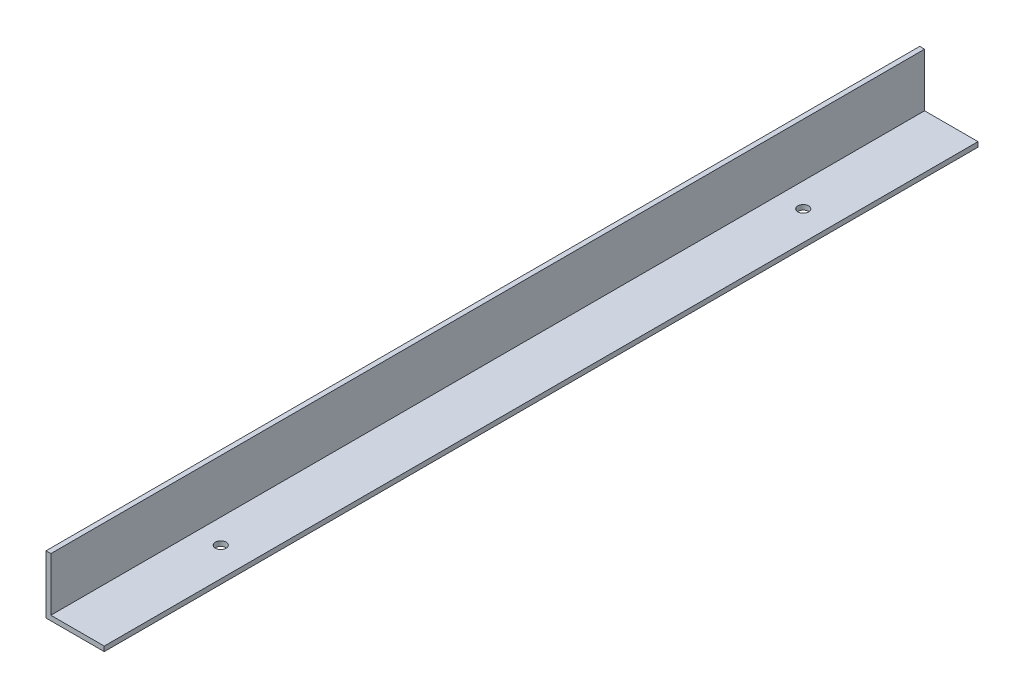
ISO-10303-21;
HEADER;
FILE_DESCRIPTION(('STEP AP214'),'2;1');
FILE_NAME('part.step','',(''),(''),'','','');
FILE_SCHEMA(('AUTOMOTIVE_DESIGN { 1 0 10303 214 1 1 1 1 }'));
ENDSEC;
DATA;
#1=APPLICATION_CONTEXT('core data for automotive mechanical design processes');
#2=APPLICATION_PROTOCOL_DEFINITION('international standard','automotive_design',2000,#1);
#3=PRODUCT_CONTEXT('',#1,'mechanical');
#4=PRODUCT('Part','Part','',(#3));
#5=PRODUCT_RELATED_PRODUCT_CATEGORY('part','',(#4));
#6=PRODUCT_DEFINITION_FORMATION('','',#4);
#7=PRODUCT_DEFINITION_CONTEXT('part definition',#1,'design');
#8=PRODUCT_DEFINITION('design','',#6,#7);
#9=PRODUCT_DEFINITION_SHAPE('','',#8);
#10=(LENGTH_UNIT() NAMED_UNIT(*) SI_UNIT(.MILLI.,.METRE.));
#11=(NAMED_UNIT(*) PLANE_ANGLE_UNIT() SI_UNIT($,.RADIAN.));
#12=(NAMED_UNIT(*) SI_UNIT($,.STERADIAN.) SOLID_ANGLE_UNIT());
#13=UNCERTAINTY_MEASURE_WITH_UNIT(LENGTH_MEASURE(1.E-05),#10,'distance_accuracy_value','');
#14=(GEOMETRIC_REPRESENTATION_CONTEXT(3) GLOBAL_UNCERTAINTY_ASSIGNED_CONTEXT((#13)) GLOBAL_UNIT_ASSIGNED_CONTEXT((#10,
#11,#12)) REPRESENTATION_CONTEXT('',''));
#15=CARTESIAN_POINT('',(0.,0.,0.));
#16=DIRECTION('',(0.,0.,1.));
#17=DIRECTION('',(1.,0.,0.));
#18=AXIS2_PLACEMENT_3D('',#15,#16,#17);
#19=CARTESIAN_POINT('',(0.,120.,1800.));
#20=DIRECTION('',(1.,0.,0.));
#21=DIRECTION('',(0.,1.,0.));
#22=AXIS2_PLACEMENT_3D('',#19,#20,#21);
#23=PLANE('',#22);
#24=DIRECTION('',(0.,-1.,0.));
#25=VECTOR('',#24,1.);
#26=CARTESIAN_POINT('',(0.,120.,0.));
#27=LINE('',#26,#25);
#28=CARTESIAN_POINT('',(0.,120.,0.));
#29=VERTEX_POINT('',#28);
#30=CARTESIAN_POINT('',(0.,0.,0.));
#31=VERTEX_POINT('',#30);
#32=EDGE_CURVE('E120',#29,#31,#27,.T.);
#33=ORIENTED_EDGE('',*,*,#32,.T.);
#34=DIRECTION('',(0.,0.,-1.));
#35=VECTOR('',#34,1.);
#36=CARTESIAN_POINT('',(0.,0.,1800.));
#37=LINE('',#36,#35);
#38=CARTESIAN_POINT('',(0.,0.,1800.));
#39=VERTEX_POINT('',#38);
#40=EDGE_CURVE('E11',#39,#31,#37,.T.);
#41=ORIENTED_EDGE('',*,*,#40,.F.);
#42=DIRECTION('',(0.,-1.,0.));
#43=VECTOR('',#42,1.);
#44=CARTESIAN_POINT('',(0.,120.,1800.));
#45=LINE('',#44,#43);
#46=CARTESIAN_POINT('',(0.,120.,1800.));
#47=VERTEX_POINT('',#46);
#48=EDGE_CURVE('E131',#47,#39,#45,.T.);
#49=ORIENTED_EDGE('',*,*,#48,.F.);
#50=DIRECTION('',(0.,0.,-1.));
#51=VECTOR('',#50,1.);
#52=CARTESIAN_POINT('',(0.,120.,1800.));
#53=LINE('',#52,#51);
#54=EDGE_CURVE('E116',#47,#29,#53,.T.);
#55=ORIENTED_EDGE('',*,*,#54,.T.);
#56=EDGE_LOOP('',(#33,#41,#49,#55));
#57=FACE_BOUND('',#56,.T.);
#58=ADVANCED_FACE('F34',(#57),#23,.F.);
#59=CARTESIAN_POINT('',(0.,0.,1800.));
#60=DIRECTION('',(0.,1.,0.));
#61=DIRECTION('',(0.,0.,1.));
#62=AXIS2_PLACEMENT_3D('',#59,#60,#61);
#63=PLANE('',#62);
#64=CARTESIAN_POINT('',(60.0000000000001,0.,300.));
#65=DIRECTION('',(0.,-1.,0.));
#66=DIRECTION('',(0.,0.,-1.));
#67=AXIS2_PLACEMENT_3D('',#64,#65,#66);
#68=CIRCLE('',#67,11.);
#69=CARTESIAN_POINT('',(60.0000000000001,0.,289.));
#70=VERTEX_POINT('',#69);
#71=EDGE_CURVE('E145',#70,#70,#68,.T.);
#72=ORIENTED_EDGE('',*,*,#71,.F.);
#73=EDGE_LOOP('',(#72));
#74=FACE_BOUND('',#73,.T.);
#75=CARTESIAN_POINT('',(60.,0.,1500.));
#76=DIRECTION('',(0.,-1.,0.));
#77=DIRECTION('',(0.,0.,-1.));
#78=AXIS2_PLACEMENT_3D('',#75,#76,#77);
#79=CIRCLE('',#78,11.);
#80=CARTESIAN_POINT('',(60.,0.,1489.));
#81=VERTEX_POINT('',#80);
#82=EDGE_CURVE('E137',#81,#81,#79,.T.);
#83=ORIENTED_EDGE('',*,*,#82,.F.);
#84=EDGE_LOOP('',(#83));
#85=FACE_BOUND('',#84,.T.);
#86=DIRECTION('',(1.,0.,0.));
#87=VECTOR('',#86,1.);
#88=CARTESIAN_POINT('',(0.,0.,0.));
#89=LINE('',#88,#87);
#90=CARTESIAN_POINT('',(120.,0.,0.));
#91=VERTEX_POINT('',#90);
#92=EDGE_CURVE('E123',#31,#91,#89,.T.);
#93=ORIENTED_EDGE('',*,*,#92,.T.);
#94=DIRECTION('',(0.,0.,-1.));
#95=VECTOR('',#94,1.);
#96=CARTESIAN_POINT('',(120.,0.,1800.));
#97=LINE('',#96,#95);
#98=CARTESIAN_POINT('',(120.,0.,1800.));
#99=VERTEX_POINT('',#98);
#100=EDGE_CURVE('E43',#99,#91,#97,.T.);
#101=ORIENTED_EDGE('',*,*,#100,.F.);
#102=DIRECTION('',(1.,0.,0.));
#103=VECTOR('',#102,1.);
#104=CARTESIAN_POINT('',(0.,0.,1800.));
#105=LINE('',#104,#103);
#106=EDGE_CURVE('E89',#39,#99,#105,.T.);
#107=ORIENTED_EDGE('',*,*,#106,.F.);
#108=ORIENTED_EDGE('',*,*,#40,.T.);
#109=EDGE_LOOP('',(#93,#101,#107,#108));
#110=FACE_BOUND('',#109,.T.);
#111=ADVANCED_FACE('F151',(#74,#85,#110),#63,.F.);
#112=CARTESIAN_POINT('',(120.,0.,1800.));
#113=DIRECTION('',(-1.,0.,0.));
#114=DIRECTION('',(0.,0.,1.));
#115=AXIS2_PLACEMENT_3D('',#112,#113,#114);
#116=PLANE('',#115);
#117=DIRECTION('',(0.,1.,0.));
#118=VECTOR('',#117,1.);
#119=CARTESIAN_POINT('',(120.,0.,0.));
#120=LINE('',#119,#118);
#121=CARTESIAN_POINT('',(120.,10.,0.));
#122=VERTEX_POINT('',#121);
#123=EDGE_CURVE('E126',#91,#122,#120,.T.);
#124=ORIENTED_EDGE('',*,*,#123,.T.);
#125=DIRECTION('',(0.,0.,-1.));
#126=VECTOR('',#125,1.);
#127=CARTESIAN_POINT('',(120.,10.,1800.));
#128=LINE('',#127,#126);
#129=CARTESIAN_POINT('',(120.,10.,1800.));
#130=VERTEX_POINT('',#129);
#131=EDGE_CURVE('E111',#130,#122,#128,.T.);
#132=ORIENTED_EDGE('',*,*,#131,.F.);
#133=DIRECTION('',(0.,1.,0.));
#134=VECTOR('',#133,1.);
#135=CARTESIAN_POINT('',(120.,0.,1800.));
#136=LINE('',#135,#134);
#137=EDGE_CURVE('E102',#99,#130,#136,.T.);
#138=ORIENTED_EDGE('',*,*,#137,.F.);
#139=ORIENTED_EDGE('',*,*,#100,.T.);
#140=EDGE_LOOP('',(#124,#132,#138,#139));
#141=FACE_BOUND('',#140,.T.);
#142=ADVANCED_FACE('F154',(#141),#116,.F.);
#143=CARTESIAN_POINT('',(120.,10.,1800.));
#144=DIRECTION('',(0.,-1.,0.));
#145=DIRECTION('',(1.,0.,0.));
#146=AXIS2_PLACEMENT_3D('',#143,#144,#145);
#147=PLANE('',#146);
#148=CARTESIAN_POINT('',(60.0000000000001,9.99999999999999,300.));
#149=DIRECTION('',(0.,-1.,0.));
#150=DIRECTION('',(1.,0.,0.));
#151=AXIS2_PLACEMENT_3D('',#148,#149,#150);
#152=CIRCLE('',#151,11.);
#153=CARTESIAN_POINT('',(71.0000000000001,9.99999999999999,300.));
#154=VERTEX_POINT('',#153);
#155=EDGE_CURVE('E37',#154,#154,#152,.T.);
#156=ORIENTED_EDGE('',*,*,#155,.T.);
#157=EDGE_LOOP('',(#156));
#158=FACE_BOUND('',#157,.T.);
#159=CARTESIAN_POINT('',(60.,9.99999999999999,1500.));
#160=DIRECTION('',(0.,-1.,0.));
#161=DIRECTION('',(1.,0.,0.));
#162=AXIS2_PLACEMENT_3D('',#159,#160,#161);
#163=CIRCLE('',#162,11.);
#164=CARTESIAN_POINT('',(71.,9.99999999999999,1500.));
#165=VERTEX_POINT('',#164);
#166=EDGE_CURVE('E124',#165,#165,#163,.T.);
#167=ORIENTED_EDGE('',*,*,#166,.T.);
#168=EDGE_LOOP('',(#167));
#169=FACE_BOUND('',#168,.T.);
#170=DIRECTION('',(-1.,0.,0.));
#171=VECTOR('',#170,1.);
#172=CARTESIAN_POINT('',(120.,10.,0.));
#173=LINE('',#172,#171);
#174=CARTESIAN_POINT('',(10.,9.99999999999999,0.));
#175=VERTEX_POINT('',#174);
#176=EDGE_CURVE('E110',#122,#175,#173,.T.);
#177=ORIENTED_EDGE('',*,*,#176,.T.);
#178=DIRECTION('',(0.,0.,-1.));
#179=VECTOR('',#178,1.);
#180=CARTESIAN_POINT('',(10.,9.99999999999999,1800.));
#181=LINE('',#180,#179);
#182=CARTESIAN_POINT('',(10.,9.99999999999999,1800.));
#183=VERTEX_POINT('',#182);
#184=EDGE_CURVE('E107',#183,#175,#181,.T.);
#185=ORIENTED_EDGE('',*,*,#184,.F.);
#186=DIRECTION('',(-1.,0.,0.));
#187=VECTOR('',#186,1.);
#188=CARTESIAN_POINT('',(120.,10.,1800.));
#189=LINE('',#188,#187);
#190=EDGE_CURVE('E96',#130,#183,#189,.T.);
#191=ORIENTED_EDGE('',*,*,#190,.F.);
#192=ORIENTED_EDGE('',*,*,#131,.T.);
#193=EDGE_LOOP('',(#177,#185,#191,#192));
#194=FACE_BOUND('',#193,.T.);
#195=ADVANCED_FACE('F108',(#158,#169,#194),#147,.F.);
#196=CARTESIAN_POINT('',(10.,9.99999999999999,1800.));
#197=DIRECTION('',(-1.,0.,0.));
#198=DIRECTION('',(0.,-1.,0.));
#199=AXIS2_PLACEMENT_3D('',#196,#197,#198);
#200=PLANE('',#199);
#201=DIRECTION('',(0.,1.,0.));
#202=VECTOR('',#201,1.);
#203=CARTESIAN_POINT('',(10.,9.99999999999999,0.));
#204=LINE('',#203,#202);
#205=CARTESIAN_POINT('',(9.99999999999999,120.,0.));
#206=VERTEX_POINT('',#205);
#207=EDGE_CURVE('E75',#175,#206,#204,.T.);
#208=ORIENTED_EDGE('',*,*,#207,.T.);
#209=DIRECTION('',(0.,0.,-1.));
#210=VECTOR('',#209,1.);
#211=CARTESIAN_POINT('',(9.99999999999999,120.,1800.));
#212=LINE('',#211,#210);
#213=CARTESIAN_POINT('',(9.99999999999999,120.,1800.));
#214=VERTEX_POINT('',#213);
#215=EDGE_CURVE('E112',#214,#206,#212,.T.);
#216=ORIENTED_EDGE('',*,*,#215,.F.);
#217=DIRECTION('',(0.,1.,0.));
#218=VECTOR('',#217,1.);
#219=CARTESIAN_POINT('',(10.,9.99999999999999,1800.));
#220=LINE('',#219,#218);
#221=EDGE_CURVE('E100',#183,#214,#220,.T.);
#222=ORIENTED_EDGE('',*,*,#221,.F.);
#223=ORIENTED_EDGE('',*,*,#184,.T.);
#224=EDGE_LOOP('',(#208,#216,#222,#223));
#225=FACE_BOUND('',#224,.T.);
#226=ADVANCED_FACE('F114',(#225),#200,.F.);
#227=CARTESIAN_POINT('',(9.99999999999999,120.,1800.));
#228=DIRECTION('',(0.,-1.,0.));
#229=DIRECTION('',(0.,0.,-1.));
#230=AXIS2_PLACEMENT_3D('',#227,#228,#229);
#231=PLANE('',#230);
#232=DIRECTION('',(-1.,0.,0.));
#233=VECTOR('',#232,1.);
#234=CARTESIAN_POINT('',(9.99999999999999,120.,0.));
#235=LINE('',#234,#233);
#236=EDGE_CURVE('E81',#206,#29,#235,.T.);
#237=ORIENTED_EDGE('',*,*,#236,.T.);
#238=ORIENTED_EDGE('',*,*,#54,.F.);
#239=DIRECTION('',(-1.,0.,0.));
#240=VECTOR('',#239,1.);
#241=CARTESIAN_POINT('',(9.99999999999999,120.,1800.));
#242=LINE('',#241,#240);
#243=EDGE_CURVE('E52',#214,#47,#242,.T.);
#244=ORIENTED_EDGE('',*,*,#243,.F.);
#245=ORIENTED_EDGE('',*,*,#215,.T.);
#246=EDGE_LOOP('',(#237,#238,#244,#245));
#247=FACE_BOUND('',#246,.T.);
#248=ADVANCED_FACE('F159',(#247),#231,.F.);
#249=CARTESIAN_POINT('',(0.,0.,1800.));
#250=DIRECTION('',(0.,0.,1.));
#251=DIRECTION('',(1.,0.,0.));
#252=AXIS2_PLACEMENT_3D('',#249,#250,#251);
#253=PLANE('',#252);
#254=ORIENTED_EDGE('',*,*,#48,.T.);
#255=ORIENTED_EDGE('',*,*,#106,.T.);
#256=ORIENTED_EDGE('',*,*,#137,.T.);
#257=ORIENTED_EDGE('',*,*,#190,.T.);
#258=ORIENTED_EDGE('',*,*,#221,.T.);
#259=ORIENTED_EDGE('',*,*,#243,.T.);
#260=EDGE_LOOP('',(#254,#255,#256,#257,#258,#259));
#261=FACE_BOUND('',#260,.T.);
#262=ADVANCED_FACE('F98',(#261),#253,.T.);
#263=CARTESIAN_POINT('',(0.,0.,0.));
#264=DIRECTION('',(0.,0.,1.));
#265=DIRECTION('',(1.,0.,0.));
#266=AXIS2_PLACEMENT_3D('',#263,#264,#265);
#267=PLANE('',#266);
#268=ORIENTED_EDGE('',*,*,#32,.F.);
#269=ORIENTED_EDGE('',*,*,#236,.F.);
#270=ORIENTED_EDGE('',*,*,#207,.F.);
#271=ORIENTED_EDGE('',*,*,#176,.F.);
#272=ORIENTED_EDGE('',*,*,#123,.F.);
#273=ORIENTED_EDGE('',*,*,#92,.F.);
#274=EDGE_LOOP('',(#268,#269,#270,#271,#272,#273));
#275=FACE_BOUND('',#274,.T.);
#276=ADVANCED_FACE('F157',(#275),#267,.F.);
#277=CARTESIAN_POINT('',(60.,120.,1500.));
#278=DIRECTION('',(0.,-1.,0.));
#279=DIRECTION('',(0.,0.,-1.));
#280=AXIS2_PLACEMENT_3D('',#277,#278,#279);
#281=CYLINDRICAL_SURFACE('',#280,11.);
#282=ORIENTED_EDGE('',*,*,#82,.T.);
#283=EDGE_LOOP('',(#282));
#284=FACE_BOUND('',#283,.T.);
#285=ORIENTED_EDGE('',*,*,#166,.F.);
#286=EDGE_LOOP('',(#285));
#287=FACE_BOUND('',#286,.T.);
#288=ADVANCED_FACE('F189',(#284,#287),#281,.F.);
#289=CARTESIAN_POINT('',(60.0000000000001,120.,300.));
#290=DIRECTION('',(0.,-1.,0.));
#291=DIRECTION('',(0.,0.,-1.));
#292=AXIS2_PLACEMENT_3D('',#289,#290,#291);
#293=CYLINDRICAL_SURFACE('',#292,11.);
#294=ORIENTED_EDGE('',*,*,#71,.T.);
#295=EDGE_LOOP('',(#294));
#296=FACE_BOUND('',#295,.T.);
#297=ORIENTED_EDGE('',*,*,#155,.F.);
#298=EDGE_LOOP('',(#297));
#299=FACE_BOUND('',#298,.T.);
#300=ADVANCED_FACE('F187',(#296,#299),#293,.F.);
#301=CLOSED_SHELL('',(#58,#111,#142,#195,#226,#248,#262,#276,#288,#300));
#302=MANIFOLD_SOLID_BREP('B2',#301);
#303=ADVANCED_BREP_SHAPE_REPRESENTATION('',(#18,#302),#14);
#304=SHAPE_DEFINITION_REPRESENTATION(#9,#303);
ENDSEC;
END-ISO-10303-21;
